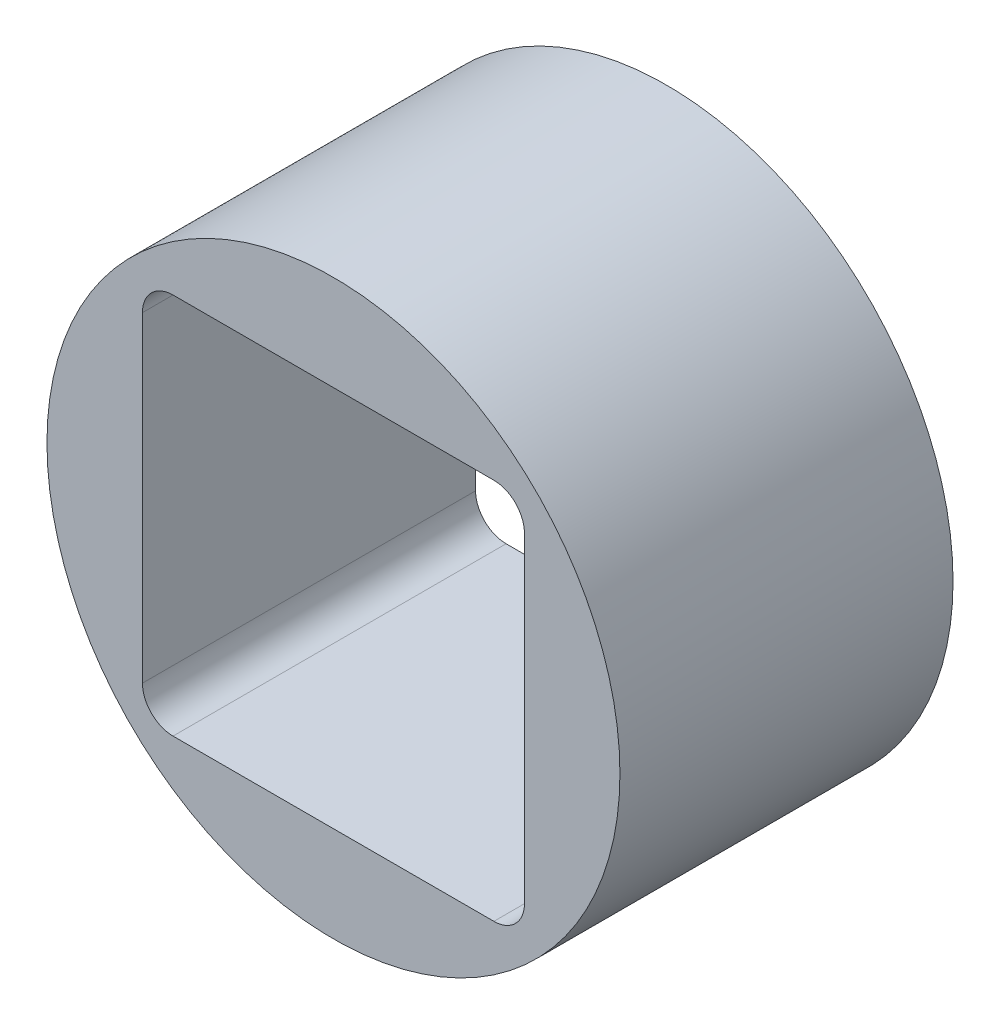
ISO-10303-21;
HEADER;
FILE_DESCRIPTION(('STEP AP214'),'2;1');
FILE_NAME('part.step','',(''),(''),'','','');
FILE_SCHEMA(('AUTOMOTIVE_DESIGN { 1 0 10303 214 1 1 1 1 }'));
ENDSEC;
DATA;
#1=APPLICATION_CONTEXT('core data for automotive mechanical design processes');
#2=APPLICATION_PROTOCOL_DEFINITION('international standard','automotive_design',2000,#1);
#3=PRODUCT_CONTEXT('',#1,'mechanical');
#4=PRODUCT('Part','Part','',(#3));
#5=PRODUCT_RELATED_PRODUCT_CATEGORY('part','',(#4));
#6=PRODUCT_DEFINITION_FORMATION('','',#4);
#7=PRODUCT_DEFINITION_CONTEXT('part definition',#1,'design');
#8=PRODUCT_DEFINITION('design','',#6,#7);
#9=PRODUCT_DEFINITION_SHAPE('','',#8);
#10=(LENGTH_UNIT() NAMED_UNIT(*) SI_UNIT(.MILLI.,.METRE.));
#11=(NAMED_UNIT(*) PLANE_ANGLE_UNIT() SI_UNIT($,.RADIAN.));
#12=(NAMED_UNIT(*) SI_UNIT($,.STERADIAN.) SOLID_ANGLE_UNIT());
#13=UNCERTAINTY_MEASURE_WITH_UNIT(LENGTH_MEASURE(1.E-05),#10,'distance_accuracy_value','');
#14=(GEOMETRIC_REPRESENTATION_CONTEXT(3) GLOBAL_UNCERTAINTY_ASSIGNED_CONTEXT((#13)) GLOBAL_UNIT_ASSIGNED_CONTEXT((#10,
#11,#12)) REPRESENTATION_CONTEXT('',''));
#15=CARTESIAN_POINT('',(0.,0.,0.));
#16=DIRECTION('',(0.,0.,1.));
#17=DIRECTION('',(1.,0.,0.));
#18=AXIS2_PLACEMENT_3D('',#15,#16,#17);
#19=CARTESIAN_POINT('',(0.,0.,5.5372));
#20=DIRECTION('',(0.,0.,1.));
#21=DIRECTION('',(1.,0.,0.));
#22=AXIS2_PLACEMENT_3D('',#19,#20,#21);
#23=PLANE('',#22);
#24=CARTESIAN_POINT('',(0.,0.,5.5372));
#25=DIRECTION('',(0.,0.,1.));
#26=DIRECTION('',(1.,0.,0.));
#27=AXIS2_PLACEMENT_3D('',#24,#25,#26);
#28=CIRCLE('',#27,4.7625);
#29=CARTESIAN_POINT('',(4.7625,0.,5.5372));
#30=VERTEX_POINT('',#29);
#31=EDGE_CURVE('E11',#30,#30,#28,.T.);
#32=ORIENTED_EDGE('',*,*,#31,.T.);
#33=EDGE_LOOP('',(#32));
#34=FACE_BOUND('',#33,.T.);
#35=DIRECTION('',(0.,-1.,0.));
#36=VECTOR('',#35,1.);
#37=CARTESIAN_POINT('',(-3.175,2.667,5.5372));
#38=LINE('',#37,#36);
#39=CARTESIAN_POINT('',(-3.175,2.667,5.5372));
#40=VERTEX_POINT('',#39);
#41=CARTESIAN_POINT('',(-3.175,-2.667,5.5372));
#42=VERTEX_POINT('',#41);
#43=EDGE_CURVE('E109',#40,#42,#38,.T.);
#44=ORIENTED_EDGE('',*,*,#43,.F.);
#45=CARTESIAN_POINT('',(-2.667,2.667,5.5372));
#46=DIRECTION('',(0.,0.,1.));
#47=DIRECTION('',(-1.,0.,0.));
#48=AXIS2_PLACEMENT_3D('',#45,#46,#47);
#49=CIRCLE('',#48,0.508);
#50=CARTESIAN_POINT('',(-2.667,3.175,5.5372));
#51=VERTEX_POINT('',#50);
#52=EDGE_CURVE('E101',#51,#40,#49,.T.);
#53=ORIENTED_EDGE('',*,*,#52,.F.);
#54=DIRECTION('',(-1.,0.,0.));
#55=VECTOR('',#54,1.);
#56=CARTESIAN_POINT('',(-2.667,3.175,5.5372));
#57=LINE('',#56,#55);
#58=CARTESIAN_POINT('',(2.667,3.175,5.5372));
#59=VERTEX_POINT('',#58);
#60=EDGE_CURVE('E133',#59,#51,#57,.T.);
#61=ORIENTED_EDGE('',*,*,#60,.F.);
#62=CARTESIAN_POINT('',(2.667,2.667,5.5372));
#63=DIRECTION('',(0.,0.,1.));
#64=DIRECTION('',(-1.,0.,0.));
#65=AXIS2_PLACEMENT_3D('',#62,#63,#64);
#66=CIRCLE('',#65,0.508);
#67=CARTESIAN_POINT('',(3.175,2.667,5.5372));
#68=VERTEX_POINT('',#67);
#69=EDGE_CURVE('E131',#68,#59,#66,.T.);
#70=ORIENTED_EDGE('',*,*,#69,.F.);
#71=DIRECTION('',(0.,1.,0.));
#72=VECTOR('',#71,1.);
#73=CARTESIAN_POINT('',(3.175,2.667,5.5372));
#74=LINE('',#73,#72);
#75=CARTESIAN_POINT('',(3.175,-2.667,5.5372));
#76=VERTEX_POINT('',#75);
#77=EDGE_CURVE('E129',#76,#68,#74,.T.);
#78=ORIENTED_EDGE('',*,*,#77,.F.);
#79=CARTESIAN_POINT('',(2.667,-2.667,5.5372));
#80=DIRECTION('',(0.,0.,1.));
#81=DIRECTION('',(1.,0.,0.));
#82=AXIS2_PLACEMENT_3D('',#79,#80,#81);
#83=CIRCLE('',#82,0.508);
#84=CARTESIAN_POINT('',(2.667,-3.175,5.5372));
#85=VERTEX_POINT('',#84);
#86=EDGE_CURVE('E127',#85,#76,#83,.T.);
#87=ORIENTED_EDGE('',*,*,#86,.F.);
#88=DIRECTION('',(1.,0.,0.));
#89=VECTOR('',#88,1.);
#90=CARTESIAN_POINT('',(-2.667,-3.175,5.5372));
#91=LINE('',#90,#89);
#92=CARTESIAN_POINT('',(-2.667,-3.175,5.5372));
#93=VERTEX_POINT('',#92);
#94=EDGE_CURVE('E123',#93,#85,#91,.T.);
#95=ORIENTED_EDGE('',*,*,#94,.F.);
#96=CARTESIAN_POINT('',(-2.667,-2.667,5.5372));
#97=DIRECTION('',(0.,0.,1.));
#98=DIRECTION('',(-1.,0.,0.));
#99=AXIS2_PLACEMENT_3D('',#96,#97,#98);
#100=CIRCLE('',#99,0.508);
#101=EDGE_CURVE('E121',#42,#93,#100,.T.);
#102=ORIENTED_EDGE('',*,*,#101,.F.);
#103=EDGE_LOOP('',(#44,#53,#61,#70,#78,#87,#95,#102));
#104=FACE_BOUND('',#103,.T.);
#105=ADVANCED_FACE('F36',(#34,#104),#23,.T.);
#106=CARTESIAN_POINT('',(0.,0.,0.));
#107=DIRECTION('',(0.,0.,1.));
#108=DIRECTION('',(1.,0.,0.));
#109=AXIS2_PLACEMENT_3D('',#106,#107,#108);
#110=PLANE('',#109);
#111=CARTESIAN_POINT('',(0.,0.,0.));
#112=DIRECTION('',(0.,0.,1.));
#113=DIRECTION('',(1.,0.,0.));
#114=AXIS2_PLACEMENT_3D('',#111,#112,#113);
#115=CIRCLE('',#114,4.7625);
#116=CARTESIAN_POINT('',(4.7625,0.,0.));
#117=VERTEX_POINT('',#116);
#118=EDGE_CURVE('E40',#117,#117,#115,.T.);
#119=ORIENTED_EDGE('',*,*,#118,.F.);
#120=EDGE_LOOP('',(#119));
#121=FACE_BOUND('',#120,.T.);
#122=CARTESIAN_POINT('',(-2.667,2.667,0.));
#123=DIRECTION('',(0.,0.,1.));
#124=DIRECTION('',(-1.,0.,0.));
#125=AXIS2_PLACEMENT_3D('',#122,#123,#124);
#126=CIRCLE('',#125,0.508);
#127=CARTESIAN_POINT('',(-2.667,3.175,0.));
#128=VERTEX_POINT('',#127);
#129=CARTESIAN_POINT('',(-3.175,2.667,0.));
#130=VERTEX_POINT('',#129);
#131=EDGE_CURVE('E59',#128,#130,#126,.T.);
#132=ORIENTED_EDGE('',*,*,#131,.T.);
#133=DIRECTION('',(0.,-1.,0.));
#134=VECTOR('',#133,1.);
#135=CARTESIAN_POINT('',(-3.175,2.667,0.));
#136=LINE('',#135,#134);
#137=CARTESIAN_POINT('',(-3.175,-2.667,0.));
#138=VERTEX_POINT('',#137);
#139=EDGE_CURVE('E116',#130,#138,#136,.T.);
#140=ORIENTED_EDGE('',*,*,#139,.T.);
#141=CARTESIAN_POINT('',(-2.667,-2.667,0.));
#142=DIRECTION('',(0.,0.,1.));
#143=DIRECTION('',(-1.,0.,0.));
#144=AXIS2_PLACEMENT_3D('',#141,#142,#143);
#145=CIRCLE('',#144,0.508);
#146=CARTESIAN_POINT('',(-2.667,-3.175,0.));
#147=VERTEX_POINT('',#146);
#148=EDGE_CURVE('E137',#138,#147,#145,.T.);
#149=ORIENTED_EDGE('',*,*,#148,.T.);
#150=DIRECTION('',(1.,0.,0.));
#151=VECTOR('',#150,1.);
#152=CARTESIAN_POINT('',(-2.667,-3.175,0.));
#153=LINE('',#152,#151);
#154=CARTESIAN_POINT('',(2.667,-3.175,0.));
#155=VERTEX_POINT('',#154);
#156=EDGE_CURVE('E140',#147,#155,#153,.T.);
#157=ORIENTED_EDGE('',*,*,#156,.T.);
#158=CARTESIAN_POINT('',(2.667,-2.667,0.));
#159=DIRECTION('',(0.,0.,1.));
#160=DIRECTION('',(1.,0.,0.));
#161=AXIS2_PLACEMENT_3D('',#158,#159,#160);
#162=CIRCLE('',#161,0.508);
#163=CARTESIAN_POINT('',(3.175,-2.667,0.));
#164=VERTEX_POINT('',#163);
#165=EDGE_CURVE('E143',#155,#164,#162,.T.);
#166=ORIENTED_EDGE('',*,*,#165,.T.);
#167=DIRECTION('',(0.,1.,0.));
#168=VECTOR('',#167,1.);
#169=CARTESIAN_POINT('',(3.175,2.667,0.));
#170=LINE('',#169,#168);
#171=CARTESIAN_POINT('',(3.175,2.667,0.));
#172=VERTEX_POINT('',#171);
#173=EDGE_CURVE('E146',#164,#172,#170,.T.);
#174=ORIENTED_EDGE('',*,*,#173,.T.);
#175=CARTESIAN_POINT('',(2.667,2.667,0.));
#176=DIRECTION('',(0.,0.,1.));
#177=DIRECTION('',(-1.,0.,0.));
#178=AXIS2_PLACEMENT_3D('',#175,#176,#177);
#179=CIRCLE('',#178,0.508);
#180=CARTESIAN_POINT('',(2.667,3.175,0.));
#181=VERTEX_POINT('',#180);
#182=EDGE_CURVE('E149',#172,#181,#179,.T.);
#183=ORIENTED_EDGE('',*,*,#182,.T.);
#184=DIRECTION('',(-1.,0.,0.));
#185=VECTOR('',#184,1.);
#186=CARTESIAN_POINT('',(-2.667,3.175,0.));
#187=LINE('',#186,#185);
#188=EDGE_CURVE('E110',#181,#128,#187,.T.);
#189=ORIENTED_EDGE('',*,*,#188,.T.);
#190=EDGE_LOOP('',(#132,#140,#149,#157,#166,#174,#183,#189));
#191=FACE_BOUND('',#190,.T.);
#192=ADVANCED_FACE('F170',(#121,#191),#110,.F.);
#193=CARTESIAN_POINT('',(0.,0.,5.5372));
#194=DIRECTION('',(0.,0.,-1.));
#195=DIRECTION('',(-1.,0.,0.));
#196=AXIS2_PLACEMENT_3D('',#193,#194,#195);
#197=CYLINDRICAL_SURFACE('',#196,4.7625);
#198=ORIENTED_EDGE('',*,*,#31,.F.);
#199=EDGE_LOOP('',(#198));
#200=FACE_BOUND('',#199,.T.);
#201=ORIENTED_EDGE('',*,*,#118,.T.);
#202=EDGE_LOOP('',(#201));
#203=FACE_BOUND('',#202,.T.);
#204=ADVANCED_FACE('F38',(#200,#203),#197,.T.);
#205=CARTESIAN_POINT('',(-2.667,2.667,5.5372));
#206=DIRECTION('',(0.,0.,-1.));
#207=DIRECTION('',(-1.,0.,0.));
#208=AXIS2_PLACEMENT_3D('',#205,#206,#207);
#209=CYLINDRICAL_SURFACE('',#208,0.508);
#210=ORIENTED_EDGE('',*,*,#131,.F.);
#211=DIRECTION('',(0.,0.,-1.));
#212=VECTOR('',#211,1.);
#213=CARTESIAN_POINT('',(-2.667,3.175,5.5372));
#214=LINE('',#213,#212);
#215=EDGE_CURVE('E105',#51,#128,#214,.T.);
#216=ORIENTED_EDGE('',*,*,#215,.F.);
#217=ORIENTED_EDGE('',*,*,#52,.T.);
#218=DIRECTION('',(0.,0.,-1.));
#219=VECTOR('',#218,1.);
#220=CARTESIAN_POINT('',(-3.175,2.667,5.5372));
#221=LINE('',#220,#219);
#222=EDGE_CURVE('E104',#40,#130,#221,.T.);
#223=ORIENTED_EDGE('',*,*,#222,.T.);
#224=EDGE_LOOP('',(#210,#216,#217,#223));
#225=FACE_BOUND('',#224,.T.);
#226=ADVANCED_FACE('F103',(#225),#209,.F.);
#227=CARTESIAN_POINT('',(-3.175,2.667,5.5372));
#228=DIRECTION('',(1.,0.,0.));
#229=DIRECTION('',(0.,1.,0.));
#230=AXIS2_PLACEMENT_3D('',#227,#228,#229);
#231=PLANE('',#230);
#232=ORIENTED_EDGE('',*,*,#139,.F.);
#233=ORIENTED_EDGE('',*,*,#222,.F.);
#234=ORIENTED_EDGE('',*,*,#43,.T.);
#235=DIRECTION('',(0.,0.,-1.));
#236=VECTOR('',#235,1.);
#237=CARTESIAN_POINT('',(-3.175,-2.667,5.5372));
#238=LINE('',#237,#236);
#239=EDGE_CURVE('E117',#42,#138,#238,.T.);
#240=ORIENTED_EDGE('',*,*,#239,.T.);
#241=EDGE_LOOP('',(#232,#233,#234,#240));
#242=FACE_BOUND('',#241,.T.);
#243=ADVANCED_FACE('F113',(#242),#231,.T.);
#244=CARTESIAN_POINT('',(-2.667,-2.667,5.5372));
#245=DIRECTION('',(0.,0.,-1.));
#246=DIRECTION('',(-1.,0.,0.));
#247=AXIS2_PLACEMENT_3D('',#244,#245,#246);
#248=CYLINDRICAL_SURFACE('',#247,0.508);
#249=ORIENTED_EDGE('',*,*,#148,.F.);
#250=ORIENTED_EDGE('',*,*,#239,.F.);
#251=ORIENTED_EDGE('',*,*,#101,.T.);
#252=DIRECTION('',(0.,0.,-1.));
#253=VECTOR('',#252,1.);
#254=CARTESIAN_POINT('',(-2.667,-3.175,5.5372));
#255=LINE('',#254,#253);
#256=EDGE_CURVE('E162',#93,#147,#255,.T.);
#257=ORIENTED_EDGE('',*,*,#256,.T.);
#258=EDGE_LOOP('',(#249,#250,#251,#257));
#259=FACE_BOUND('',#258,.T.);
#260=ADVANCED_FACE('F166',(#259),#248,.F.);
#261=CARTESIAN_POINT('',(-2.667,-3.175,5.5372));
#262=DIRECTION('',(0.,1.,0.));
#263=DIRECTION('',(0.,0.,1.));
#264=AXIS2_PLACEMENT_3D('',#261,#262,#263);
#265=PLANE('',#264);
#266=ORIENTED_EDGE('',*,*,#156,.F.);
#267=ORIENTED_EDGE('',*,*,#256,.F.);
#268=ORIENTED_EDGE('',*,*,#94,.T.);
#269=DIRECTION('',(0.,0.,-1.));
#270=VECTOR('',#269,1.);
#271=CARTESIAN_POINT('',(2.667,-3.175,5.5372));
#272=LINE('',#271,#270);
#273=EDGE_CURVE('E160',#85,#155,#272,.T.);
#274=ORIENTED_EDGE('',*,*,#273,.T.);
#275=EDGE_LOOP('',(#266,#267,#268,#274));
#276=FACE_BOUND('',#275,.T.);
#277=ADVANCED_FACE('F188',(#276),#265,.T.);
#278=CARTESIAN_POINT('',(2.667,-2.667,5.5372));
#279=DIRECTION('',(0.,0.,-1.));
#280=DIRECTION('',(-1.,0.,0.));
#281=AXIS2_PLACEMENT_3D('',#278,#279,#280);
#282=CYLINDRICAL_SURFACE('',#281,0.508);
#283=ORIENTED_EDGE('',*,*,#165,.F.);
#284=ORIENTED_EDGE('',*,*,#273,.F.);
#285=ORIENTED_EDGE('',*,*,#86,.T.);
#286=DIRECTION('',(0.,0.,-1.));
#287=VECTOR('',#286,1.);
#288=CARTESIAN_POINT('',(3.175,-2.667,5.5372));
#289=LINE('',#288,#287);
#290=EDGE_CURVE('E158',#76,#164,#289,.T.);
#291=ORIENTED_EDGE('',*,*,#290,.T.);
#292=EDGE_LOOP('',(#283,#284,#285,#291));
#293=FACE_BOUND('',#292,.T.);
#294=ADVANCED_FACE('F185',(#293),#282,.F.);
#295=CARTESIAN_POINT('',(3.175,2.667,5.5372));
#296=DIRECTION('',(-1.,0.,0.));
#297=DIRECTION('',(0.,-1.,0.));
#298=AXIS2_PLACEMENT_3D('',#295,#296,#297);
#299=PLANE('',#298);
#300=ORIENTED_EDGE('',*,*,#173,.F.);
#301=ORIENTED_EDGE('',*,*,#290,.F.);
#302=ORIENTED_EDGE('',*,*,#77,.T.);
#303=DIRECTION('',(0.,0.,-1.));
#304=VECTOR('',#303,1.);
#305=CARTESIAN_POINT('',(3.175,2.667,5.5372));
#306=LINE('',#305,#304);
#307=EDGE_CURVE('E156',#68,#172,#306,.T.);
#308=ORIENTED_EDGE('',*,*,#307,.T.);
#309=EDGE_LOOP('',(#300,#301,#302,#308));
#310=FACE_BOUND('',#309,.T.);
#311=ADVANCED_FACE('F181',(#310),#299,.T.);
#312=CARTESIAN_POINT('',(2.667,2.667,5.5372));
#313=DIRECTION('',(0.,0.,-1.));
#314=DIRECTION('',(-1.,0.,0.));
#315=AXIS2_PLACEMENT_3D('',#312,#313,#314);
#316=CYLINDRICAL_SURFACE('',#315,0.508);
#317=ORIENTED_EDGE('',*,*,#182,.F.);
#318=ORIENTED_EDGE('',*,*,#307,.F.);
#319=ORIENTED_EDGE('',*,*,#69,.T.);
#320=DIRECTION('',(0.,0.,-1.));
#321=VECTOR('',#320,1.);
#322=CARTESIAN_POINT('',(2.667,3.175,5.5372));
#323=LINE('',#322,#321);
#324=EDGE_CURVE('E51',#59,#181,#323,.T.);
#325=ORIENTED_EDGE('',*,*,#324,.T.);
#326=EDGE_LOOP('',(#317,#318,#319,#325));
#327=FACE_BOUND('',#326,.T.);
#328=ADVANCED_FACE('F178',(#327),#316,.F.);
#329=CARTESIAN_POINT('',(-2.667,3.175,5.5372));
#330=DIRECTION('',(0.,-1.,0.));
#331=DIRECTION('',(0.,0.,-1.));
#332=AXIS2_PLACEMENT_3D('',#329,#330,#331);
#333=PLANE('',#332);
#334=ORIENTED_EDGE('',*,*,#188,.F.);
#335=ORIENTED_EDGE('',*,*,#324,.F.);
#336=ORIENTED_EDGE('',*,*,#60,.T.);
#337=ORIENTED_EDGE('',*,*,#215,.T.);
#338=EDGE_LOOP('',(#334,#335,#336,#337));
#339=FACE_BOUND('',#338,.T.);
#340=ADVANCED_FACE('F172',(#339),#333,.T.);
#341=CLOSED_SHELL('',(#105,#192,#204,#226,#243,#260,#277,#294,#311,#328,#340));
#342=MANIFOLD_SOLID_BREP('B2',#341);
#343=ADVANCED_BREP_SHAPE_REPRESENTATION('',(#18,#342),#14);
#344=SHAPE_DEFINITION_REPRESENTATION(#9,#343);
ENDSEC;
END-ISO-10303-21;
